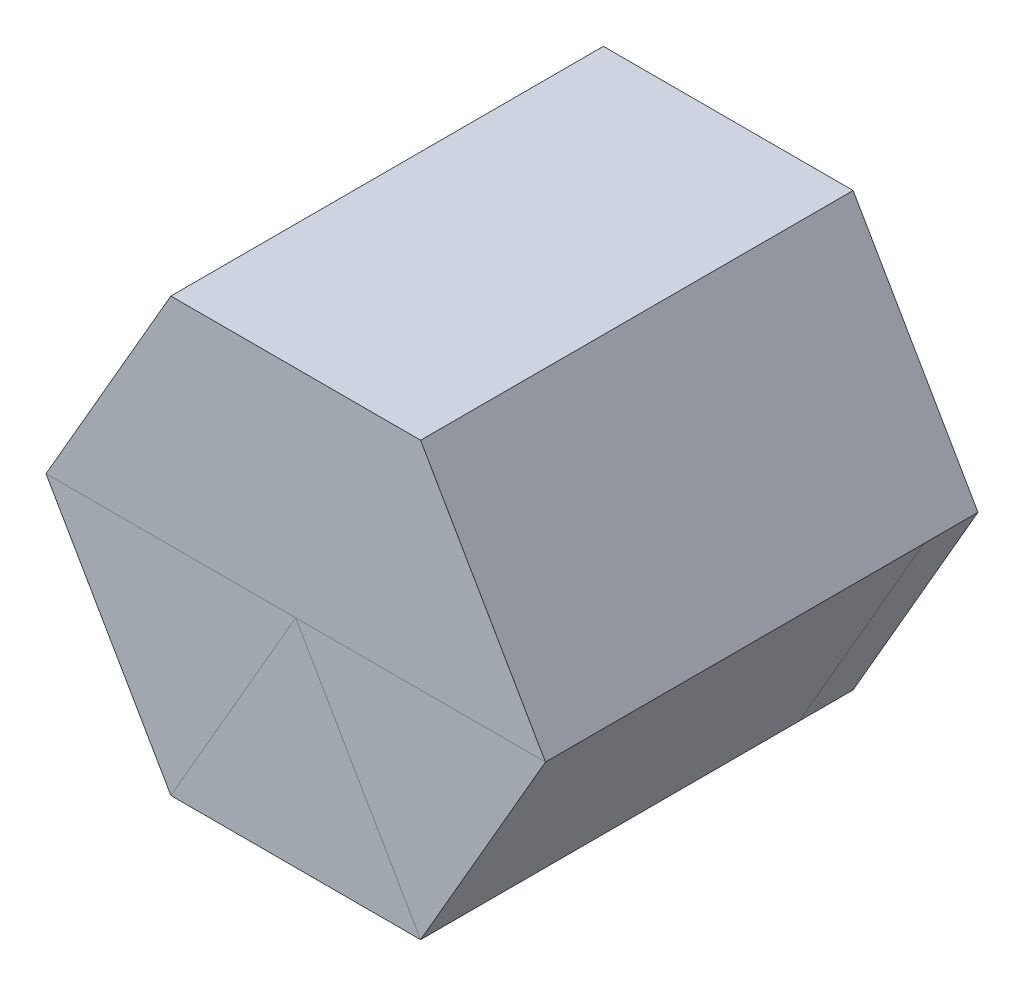
ISO-10303-21;
HEADER;
FILE_DESCRIPTION(('STEP AP214'),'2;1');
FILE_NAME('part.step','',(''),(''),'','','');
FILE_SCHEMA(('AUTOMOTIVE_DESIGN { 1 0 10303 214 1 1 1 1 }'));
ENDSEC;
DATA;
#1=APPLICATION_CONTEXT('core data for automotive mechanical design processes');
#2=APPLICATION_PROTOCOL_DEFINITION('international standard','automotive_design',2000,#1);
#3=PRODUCT_CONTEXT('',#1,'mechanical');
#4=PRODUCT('Part','Part','',(#3));
#5=PRODUCT_RELATED_PRODUCT_CATEGORY('part','',(#4));
#6=PRODUCT_DEFINITION_FORMATION('','',#4);
#7=PRODUCT_DEFINITION_CONTEXT('part definition',#1,'design');
#8=PRODUCT_DEFINITION('design','',#6,#7);
#9=PRODUCT_DEFINITION_SHAPE('','',#8);
#10=(LENGTH_UNIT() NAMED_UNIT(*) SI_UNIT(.MILLI.,.METRE.));
#11=(NAMED_UNIT(*) PLANE_ANGLE_UNIT() SI_UNIT($,.RADIAN.));
#12=(NAMED_UNIT(*) SI_UNIT($,.STERADIAN.) SOLID_ANGLE_UNIT());
#13=UNCERTAINTY_MEASURE_WITH_UNIT(LENGTH_MEASURE(1.E-05),#10,'distance_accuracy_value','');
#14=(GEOMETRIC_REPRESENTATION_CONTEXT(3) GLOBAL_UNCERTAINTY_ASSIGNED_CONTEXT((#13)) GLOBAL_UNIT_ASSIGNED_CONTEXT((#10,
#11,#12)) REPRESENTATION_CONTEXT('',''));
#15=CARTESIAN_POINT('',(0.,0.,0.));
#16=DIRECTION('',(0.,0.,1.));
#17=DIRECTION('',(1.,0.,0.));
#18=AXIS2_PLACEMENT_3D('',#15,#16,#17);
#19=CARTESIAN_POINT('',(21.9970452561247,-12.7,89.5991408839594));
#20=DIRECTION('',(0.866025403784438,-0.5,0.));
#21=DIRECTION('',(0.5,0.866025403784439,0.));
#22=AXIS2_PLACEMENT_3D('',#19,#20,#21);
#23=PLANE('',#22);
#24=DIRECTION('',(0.,0.,-1.));
#25=VECTOR('',#24,1.);
#26=CARTESIAN_POINT('',(29.329393674833,0.,89.5991408839594));
#27=LINE('',#26,#25);
#28=CARTESIAN_POINT('',(29.329393674833,0.,50.8));
#29=VERTEX_POINT('',#28);
#30=CARTESIAN_POINT('',(29.329393674833,0.,6.35));
#31=VERTEX_POINT('',#30);
#32=EDGE_CURVE('E85',#29,#31,#27,.T.);
#33=ORIENTED_EDGE('',*,*,#32,.F.);
#34=DIRECTION('',(-0.5,-0.866025403784439,0.));
#35=VECTOR('',#34,1.);
#36=CARTESIAN_POINT('',(21.9970452561247,-12.7,50.8));
#37=LINE('',#36,#35);
#38=CARTESIAN_POINT('',(14.6646968374165,-25.4,50.8));
#39=VERTEX_POINT('',#38);
#40=EDGE_CURVE('E102',#29,#39,#37,.T.);
#41=ORIENTED_EDGE('',*,*,#40,.T.);
#42=DIRECTION('',(0.,0.,-1.));
#43=VECTOR('',#42,1.);
#44=CARTESIAN_POINT('',(14.6646968374165,-25.4,89.5991408839594));
#45=LINE('',#44,#43);
#46=CARTESIAN_POINT('',(14.6646968374165,-25.4,6.35));
#47=VERTEX_POINT('',#46);
#48=EDGE_CURVE('E52',#39,#47,#45,.T.);
#49=ORIENTED_EDGE('',*,*,#48,.T.);
#50=DIRECTION('',(-0.5,-0.866025403784439,0.));
#51=VECTOR('',#50,1.);
#52=CARTESIAN_POINT('',(21.9970452561247,-12.7,6.35));
#53=LINE('',#52,#51);
#54=EDGE_CURVE('E95',#31,#47,#53,.T.);
#55=ORIENTED_EDGE('',*,*,#54,.F.);
#56=EDGE_LOOP('',(#33,#41,#49,#55));
#57=FACE_BOUND('',#56,.T.);
#58=ADVANCED_FACE('F48',(#57),#23,.T.);
#59=CARTESIAN_POINT('',(0.,0.,89.5991408839594));
#60=DIRECTION('',(0.,-1.,0.));
#61=DIRECTION('',(0.,0.,-1.));
#62=AXIS2_PLACEMENT_3D('',#59,#60,#61);
#63=PLANE('',#62);
#64=DIRECTION('',(-1.,0.,0.));
#65=VECTOR('',#64,1.);
#66=CARTESIAN_POINT('',(0.,0.,50.8));
#67=LINE('',#66,#65);
#68=CARTESIAN_POINT('',(0.,0.,50.8));
#69=VERTEX_POINT('',#68);
#70=EDGE_CURVE('E57',#29,#69,#67,.T.);
#71=ORIENTED_EDGE('',*,*,#70,.F.);
#72=ORIENTED_EDGE('',*,*,#32,.T.);
#73=DIRECTION('',(-1.,0.,0.));
#74=VECTOR('',#73,1.);
#75=CARTESIAN_POINT('',(0.,0.,6.35));
#76=LINE('',#75,#74);
#77=CARTESIAN_POINT('',(0.,0.,6.35));
#78=VERTEX_POINT('',#77);
#79=EDGE_CURVE('E88',#31,#78,#76,.T.);
#80=ORIENTED_EDGE('',*,*,#79,.T.);
#81=DIRECTION('',(0.,0.,-1.));
#82=VECTOR('',#81,1.);
#83=CARTESIAN_POINT('',(0.,0.,89.5991408839594));
#84=LINE('',#83,#82);
#85=EDGE_CURVE('E70',#69,#78,#84,.T.);
#86=ORIENTED_EDGE('',*,*,#85,.F.);
#87=EDGE_LOOP('',(#71,#72,#80,#86));
#88=FACE_BOUND('',#87,.T.);
#89=ADVANCED_FACE('F87',(#88),#63,.F.);
#90=CARTESIAN_POINT('',(0.,0.,89.5991408839594));
#91=DIRECTION('',(0.866025403784439,0.5,0.));
#92=DIRECTION('',(-0.5,0.866025403784439,0.));
#93=AXIS2_PLACEMENT_3D('',#90,#91,#92);
#94=PLANE('',#93);
#95=DIRECTION('',(0.5,-0.866025403784439,0.));
#96=VECTOR('',#95,1.);
#97=CARTESIAN_POINT('',(0.,0.,50.8));
#98=LINE('',#97,#96);
#99=EDGE_CURVE('E12',#69,#39,#98,.T.);
#100=ORIENTED_EDGE('',*,*,#99,.F.);
#101=ORIENTED_EDGE('',*,*,#85,.T.);
#102=DIRECTION('',(0.5,-0.866025403784439,0.));
#103=VECTOR('',#102,1.);
#104=CARTESIAN_POINT('',(0.,0.,6.35));
#105=LINE('',#104,#103);
#106=EDGE_CURVE('E96',#78,#47,#105,.T.);
#107=ORIENTED_EDGE('',*,*,#106,.T.);
#108=ORIENTED_EDGE('',*,*,#48,.F.);
#109=EDGE_LOOP('',(#100,#101,#107,#108));
#110=FACE_BOUND('',#109,.T.);
#111=ADVANCED_FACE('F104',(#110),#94,.F.);
#112=CARTESIAN_POINT('',(0.,0.,6.35));
#113=DIRECTION('',(0.,0.,1.));
#114=DIRECTION('',(1.,0.,0.));
#115=AXIS2_PLACEMENT_3D('',#112,#113,#114);
#116=PLANE('',#115);
#117=ORIENTED_EDGE('',*,*,#54,.T.);
#118=ORIENTED_EDGE('',*,*,#106,.F.);
#119=ORIENTED_EDGE('',*,*,#79,.F.);
#120=EDGE_LOOP('',(#117,#118,#119));
#121=FACE_BOUND('',#120,.T.);
#122=ADVANCED_FACE('F94',(#121),#116,.F.);
#123=CARTESIAN_POINT('',(0.,0.,50.8));
#124=DIRECTION('',(0.,0.,1.));
#125=DIRECTION('',(1.,0.,0.));
#126=AXIS2_PLACEMENT_3D('',#123,#124,#125);
#127=PLANE('',#126);
#128=ORIENTED_EDGE('',*,*,#40,.F.);
#129=ORIENTED_EDGE('',*,*,#70,.T.);
#130=ORIENTED_EDGE('',*,*,#99,.T.);
#131=EDGE_LOOP('',(#128,#129,#130));
#132=FACE_BOUND('',#131,.T.);
#133=ADVANCED_FACE('F50',(#132),#127,.T.);
#134=CLOSED_SHELL('',(#58,#89,#111,#122,#133));
#135=MANIFOLD_SOLID_BREP('B2',#134);
#136=CARTESIAN_POINT('',(0.,0.,50.8));
#137=DIRECTION('',(0.,0.,1.));
#138=DIRECTION('',(1.,0.,0.));
#139=AXIS2_PLACEMENT_3D('',#136,#137,#138);
#140=PLANE('',#139);
#141=DIRECTION('',(0.5,-0.866025403784439,0.));
#142=VECTOR('',#141,1.);
#143=CARTESIAN_POINT('',(0.,0.,50.8));
#144=LINE('',#143,#142);
#145=CARTESIAN_POINT('',(0.,0.,50.8));
#146=VERTEX_POINT('',#145);
#147=CARTESIAN_POINT('',(14.6646968374165,-25.4,50.8));
#148=VERTEX_POINT('',#147);
#149=EDGE_CURVE('E188',#146,#148,#144,.T.);
#150=ORIENTED_EDGE('',*,*,#149,.F.);
#151=DIRECTION('',(-0.5,-0.866025403784439,0.));
#152=VECTOR('',#151,1.);
#153=CARTESIAN_POINT('',(0.,0.,50.8));
#154=LINE('',#153,#152);
#155=CARTESIAN_POINT('',(-14.6646968374165,-25.4,50.8));
#156=VERTEX_POINT('',#155);
#157=EDGE_CURVE('E185',#146,#156,#154,.T.);
#158=ORIENTED_EDGE('',*,*,#157,.T.);
#159=DIRECTION('',(-1.,0.,0.));
#160=VECTOR('',#159,1.);
#161=CARTESIAN_POINT('',(0.,-25.4,50.8));
#162=LINE('',#161,#160);
#163=EDGE_CURVE('E190',#148,#156,#162,.T.);
#164=ORIENTED_EDGE('',*,*,#163,.F.);
#165=EDGE_LOOP('',(#150,#158,#164));
#166=FACE_BOUND('',#165,.T.);
#167=ADVANCED_FACE('F156',(#166),#140,.T.);
#168=CARTESIAN_POINT('',(0.,0.,6.35));
#169=DIRECTION('',(0.,0.,-1.));
#170=DIRECTION('',(-1.,0.,0.));
#171=AXIS2_PLACEMENT_3D('',#168,#169,#170);
#172=PLANE('',#171);
#173=DIRECTION('',(-0.5,-0.866025403784439,0.));
#174=VECTOR('',#173,1.);
#175=CARTESIAN_POINT('',(0.,0.,6.35));
#176=LINE('',#175,#174);
#177=CARTESIAN_POINT('',(0.,0.,6.35));
#178=VERTEX_POINT('',#177);
#179=CARTESIAN_POINT('',(-14.6646968374165,-25.4,6.35));
#180=VERTEX_POINT('',#179);
#181=EDGE_CURVE('E46',#178,#180,#176,.T.);
#182=ORIENTED_EDGE('',*,*,#181,.F.);
#183=DIRECTION('',(0.5,-0.866025403784439,0.));
#184=VECTOR('',#183,1.);
#185=CARTESIAN_POINT('',(0.,0.,6.35));
#186=LINE('',#185,#184);
#187=CARTESIAN_POINT('',(14.6646968374165,-25.4,6.35));
#188=VERTEX_POINT('',#187);
#189=EDGE_CURVE('E198',#178,#188,#186,.T.);
#190=ORIENTED_EDGE('',*,*,#189,.T.);
#191=DIRECTION('',(-1.,0.,0.));
#192=VECTOR('',#191,1.);
#193=CARTESIAN_POINT('',(0.,-25.4,6.35));
#194=LINE('',#193,#192);
#195=EDGE_CURVE('E194',#188,#180,#194,.T.);
#196=ORIENTED_EDGE('',*,*,#195,.T.);
#197=EDGE_LOOP('',(#182,#190,#196));
#198=FACE_BOUND('',#197,.T.);
#199=ADVANCED_FACE('F211',(#198),#172,.T.);
#200=CARTESIAN_POINT('',(0.,0.,89.5991408839594));
#201=DIRECTION('',(0.866025403784439,0.5,0.));
#202=DIRECTION('',(-0.5,0.866025403784439,0.));
#203=AXIS2_PLACEMENT_3D('',#200,#201,#202);
#204=PLANE('',#203);
#205=DIRECTION('',(0.,0.,-1.));
#206=VECTOR('',#205,1.);
#207=CARTESIAN_POINT('',(0.,0.,89.5991408839594));
#208=LINE('',#207,#206);
#209=EDGE_CURVE('E159',#146,#178,#208,.T.);
#210=ORIENTED_EDGE('',*,*,#209,.F.);
#211=ORIENTED_EDGE('',*,*,#149,.T.);
#212=DIRECTION('',(0.,0.,-1.));
#213=VECTOR('',#212,1.);
#214=CARTESIAN_POINT('',(14.6646968374165,-25.4,89.5991408839594));
#215=LINE('',#214,#213);
#216=EDGE_CURVE('E193',#148,#188,#215,.T.);
#217=ORIENTED_EDGE('',*,*,#216,.T.);
#218=ORIENTED_EDGE('',*,*,#189,.F.);
#219=EDGE_LOOP('',(#210,#211,#217,#218));
#220=FACE_BOUND('',#219,.T.);
#221=ADVANCED_FACE('F201',(#220),#204,.T.);
#222=CARTESIAN_POINT('',(0.,-25.4,89.5991408839594));
#223=DIRECTION('',(0.,-1.,0.));
#224=DIRECTION('',(0.,0.,-1.));
#225=AXIS2_PLACEMENT_3D('',#222,#223,#224);
#226=PLANE('',#225);
#227=ORIENTED_EDGE('',*,*,#216,.F.);
#228=ORIENTED_EDGE('',*,*,#163,.T.);
#229=DIRECTION('',(0.,0.,-1.));
#230=VECTOR('',#229,1.);
#231=CARTESIAN_POINT('',(-14.6646968374165,-25.4,89.5991408839594));
#232=LINE('',#231,#230);
#233=EDGE_CURVE('E197',#156,#180,#232,.T.);
#234=ORIENTED_EDGE('',*,*,#233,.T.);
#235=ORIENTED_EDGE('',*,*,#195,.F.);
#236=EDGE_LOOP('',(#227,#228,#234,#235));
#237=FACE_BOUND('',#236,.T.);
#238=ADVANCED_FACE('F208',(#237),#226,.T.);
#239=CARTESIAN_POINT('',(0.,0.,89.5991408839594));
#240=DIRECTION('',(0.866025403784439,-0.5,0.));
#241=DIRECTION('',(0.5,0.866025403784439,0.));
#242=AXIS2_PLACEMENT_3D('',#239,#240,#241);
#243=PLANE('',#242);
#244=ORIENTED_EDGE('',*,*,#157,.F.);
#245=ORIENTED_EDGE('',*,*,#209,.T.);
#246=ORIENTED_EDGE('',*,*,#181,.T.);
#247=ORIENTED_EDGE('',*,*,#233,.F.);
#248=EDGE_LOOP('',(#244,#245,#246,#247));
#249=FACE_BOUND('',#248,.T.);
#250=ADVANCED_FACE('F196',(#249),#243,.F.);
#251=CLOSED_SHELL('',(#167,#199,#221,#238,#250));
#252=MANIFOLD_SOLID_BREP('B6',#251);
#253=CARTESIAN_POINT('',(0.,0.,50.8));
#254=DIRECTION('',(0.,0.,1.));
#255=DIRECTION('',(1.,0.,0.));
#256=AXIS2_PLACEMENT_3D('',#253,#254,#255);
#257=PLANE('',#256);
#258=DIRECTION('',(-0.5,-0.866025403784439,0.));
#259=VECTOR('',#258,1.);
#260=CARTESIAN_POINT('',(0.,0.,50.8));
#261=LINE('',#260,#259);
#262=CARTESIAN_POINT('',(0.,0.,50.8));
#263=VERTEX_POINT('',#262);
#264=CARTESIAN_POINT('',(-14.6646968374165,-25.4,50.8));
#265=VERTEX_POINT('',#264);
#266=EDGE_CURVE('E271',#263,#265,#261,.T.);
#267=ORIENTED_EDGE('',*,*,#266,.F.);
#268=DIRECTION('',(1.,0.,0.));
#269=VECTOR('',#268,1.);
#270=CARTESIAN_POINT('',(0.,0.,50.8));
#271=LINE('',#270,#269);
#272=CARTESIAN_POINT('',(-29.329393674833,0.,50.8));
#273=VERTEX_POINT('',#272);
#274=EDGE_CURVE('E292',#273,#263,#271,.T.);
#275=ORIENTED_EDGE('',*,*,#274,.F.);
#276=DIRECTION('',(-0.5,0.866025403784439,0.));
#277=VECTOR('',#276,1.);
#278=CARTESIAN_POINT('',(-21.9970452561247,-12.7,50.8));
#279=LINE('',#278,#277);
#280=EDGE_CURVE('E295',#265,#273,#279,.T.);
#281=ORIENTED_EDGE('',*,*,#280,.F.);
#282=EDGE_LOOP('',(#267,#275,#281));
#283=FACE_BOUND('',#282,.T.);
#284=ADVANCED_FACE('F263',(#283),#257,.T.);
#285=CARTESIAN_POINT('',(0.,0.,6.35));
#286=DIRECTION('',(0.,0.,-1.));
#287=DIRECTION('',(-1.,0.,0.));
#288=AXIS2_PLACEMENT_3D('',#285,#286,#287);
#289=PLANE('',#288);
#290=DIRECTION('',(-0.5,-0.866025403784439,0.));
#291=VECTOR('',#290,1.);
#292=CARTESIAN_POINT('',(0.,0.,6.35));
#293=LINE('',#292,#291);
#294=CARTESIAN_POINT('',(0.,0.,6.35));
#295=VERTEX_POINT('',#294);
#296=CARTESIAN_POINT('',(-14.6646968374165,-25.4,6.35));
#297=VERTEX_POINT('',#296);
#298=EDGE_CURVE('E309',#295,#297,#293,.T.);
#299=ORIENTED_EDGE('',*,*,#298,.T.);
#300=DIRECTION('',(-0.5,0.866025403784439,0.));
#301=VECTOR('',#300,1.);
#302=CARTESIAN_POINT('',(-21.9970452561247,-12.7,6.35));
#303=LINE('',#302,#301);
#304=CARTESIAN_POINT('',(-29.329393674833,0.,6.35));
#305=VERTEX_POINT('',#304);
#306=EDGE_CURVE('E301',#297,#305,#303,.T.);
#307=ORIENTED_EDGE('',*,*,#306,.T.);
#308=DIRECTION('',(1.,0.,0.));
#309=VECTOR('',#308,1.);
#310=CARTESIAN_POINT('',(0.,0.,6.35));
#311=LINE('',#310,#309);
#312=EDGE_CURVE('E308',#305,#295,#311,.T.);
#313=ORIENTED_EDGE('',*,*,#312,.T.);
#314=EDGE_LOOP('',(#299,#307,#313));
#315=FACE_BOUND('',#314,.T.);
#316=ADVANCED_FACE('F307',(#315),#289,.T.);
#317=CARTESIAN_POINT('',(-21.9970452561247,-12.7,89.5991408839594));
#318=DIRECTION('',(-0.866025403784438,-0.5,0.));
#319=DIRECTION('',(0.5,-0.866025403784439,0.));
#320=AXIS2_PLACEMENT_3D('',#317,#318,#319);
#321=PLANE('',#320);
#322=DIRECTION('',(0.,0.,-1.));
#323=VECTOR('',#322,1.);
#324=CARTESIAN_POINT('',(-14.6646968374165,-25.4,89.5991408839594));
#325=LINE('',#324,#323);
#326=EDGE_CURVE('E154',#265,#297,#325,.T.);
#327=ORIENTED_EDGE('',*,*,#326,.F.);
#328=ORIENTED_EDGE('',*,*,#280,.T.);
#329=DIRECTION('',(0.,0.,-1.));
#330=VECTOR('',#329,1.);
#331=CARTESIAN_POINT('',(-29.329393674833,0.,89.5991408839594));
#332=LINE('',#331,#330);
#333=EDGE_CURVE('E298',#273,#305,#332,.T.);
#334=ORIENTED_EDGE('',*,*,#333,.T.);
#335=ORIENTED_EDGE('',*,*,#306,.F.);
#336=EDGE_LOOP('',(#327,#328,#334,#335));
#337=FACE_BOUND('',#336,.T.);
#338=ADVANCED_FACE('F300',(#337),#321,.T.);
#339=CARTESIAN_POINT('',(0.,0.,89.5991408839594));
#340=DIRECTION('',(0.,1.,0.));
#341=DIRECTION('',(0.,0.,1.));
#342=AXIS2_PLACEMENT_3D('',#339,#340,#341);
#343=PLANE('',#342);
#344=ORIENTED_EDGE('',*,*,#333,.F.);
#345=ORIENTED_EDGE('',*,*,#274,.T.);
#346=DIRECTION('',(0.,0.,-1.));
#347=VECTOR('',#346,1.);
#348=CARTESIAN_POINT('',(0.,0.,89.5991408839594));
#349=LINE('',#348,#347);
#350=EDGE_CURVE('E312',#263,#295,#349,.T.);
#351=ORIENTED_EDGE('',*,*,#350,.T.);
#352=ORIENTED_EDGE('',*,*,#312,.F.);
#353=EDGE_LOOP('',(#344,#345,#351,#352));
#354=FACE_BOUND('',#353,.T.);
#355=ADVANCED_FACE('F311',(#354),#343,.T.);
#356=CARTESIAN_POINT('',(0.,0.,89.5991408839594));
#357=DIRECTION('',(0.866025403784439,-0.5,0.));
#358=DIRECTION('',(0.5,0.866025403784439,0.));
#359=AXIS2_PLACEMENT_3D('',#356,#357,#358);
#360=PLANE('',#359);
#361=ORIENTED_EDGE('',*,*,#350,.F.);
#362=ORIENTED_EDGE('',*,*,#266,.T.);
#363=ORIENTED_EDGE('',*,*,#326,.T.);
#364=ORIENTED_EDGE('',*,*,#298,.F.);
#365=EDGE_LOOP('',(#361,#362,#363,#364));
#366=FACE_BOUND('',#365,.T.);
#367=ADVANCED_FACE('F319',(#366),#360,.T.);
#368=CLOSED_SHELL('',(#284,#316,#338,#355,#367));
#369=MANIFOLD_SOLID_BREP('B40',#368);
#370=CARTESIAN_POINT('',(0.,0.,50.8));
#371=DIRECTION('',(0.,-1.,0.));
#372=DIRECTION('',(0.,0.,-1.));
#373=AXIS2_PLACEMENT_3D('',#370,#371,#372);
#374=PLANE('',#373);
#375=DIRECTION('',(-1.,0.,0.));
#376=VECTOR('',#375,1.);
#377=CARTESIAN_POINT('',(0.,0.,6.35));
#378=LINE('',#377,#376);
#379=CARTESIAN_POINT('',(29.329393674833,0.,6.35));
#380=VERTEX_POINT('',#379);
#381=CARTESIAN_POINT('',(-29.329393674833,0.,6.35));
#382=VERTEX_POINT('',#381);
#383=EDGE_CURVE('E377',#380,#382,#378,.T.);
#384=ORIENTED_EDGE('',*,*,#383,.F.);
#385=DIRECTION('',(0.,0.,-1.));
#386=VECTOR('',#385,1.);
#387=CARTESIAN_POINT('',(29.329393674833,0.,50.8));
#388=LINE('',#387,#386);
#389=CARTESIAN_POINT('',(29.329393674833,0.,50.8));
#390=VERTEX_POINT('',#389);
#391=EDGE_CURVE('E261',#390,#380,#388,.T.);
#392=ORIENTED_EDGE('',*,*,#391,.F.);
#393=DIRECTION('',(-1.,0.,0.));
#394=VECTOR('',#393,1.);
#395=CARTESIAN_POINT('',(0.,0.,50.8));
#396=LINE('',#395,#394);
#397=CARTESIAN_POINT('',(-29.329393674833,0.,50.8));
#398=VERTEX_POINT('',#397);
#399=EDGE_CURVE('E459',#390,#398,#396,.T.);
#400=ORIENTED_EDGE('',*,*,#399,.T.);
#401=DIRECTION('',(0.,0.,-1.));
#402=VECTOR('',#401,1.);
#403=CARTESIAN_POINT('',(-29.329393674833,0.,50.8));
#404=LINE('',#403,#402);
#405=EDGE_CURVE('E465',#398,#382,#404,.T.);
#406=ORIENTED_EDGE('',*,*,#405,.T.);
#407=EDGE_LOOP('',(#384,#392,#400,#406));
#408=FACE_BOUND('',#407,.T.);
#409=ADVANCED_FACE('F361',(#408),#374,.T.);
#410=CARTESIAN_POINT('',(21.9970452561247,12.7,50.8));
#411=DIRECTION('',(-0.866025403784439,-0.5,0.));
#412=DIRECTION('',(0.5,-0.866025403784439,0.));
#413=AXIS2_PLACEMENT_3D('',#410,#411,#412);
#414=PLANE('',#413);
#415=DIRECTION('',(-0.5,0.866025403784439,0.));
#416=VECTOR('',#415,1.);
#417=CARTESIAN_POINT('',(21.9970452561247,12.7,0.));
#418=LINE('',#417,#416);
#419=CARTESIAN_POINT('',(29.329393674833,0.,0.));
#420=VERTEX_POINT('',#419);
#421=CARTESIAN_POINT('',(14.6646968374165,25.4,0.));
#422=VERTEX_POINT('',#421);
#423=EDGE_CURVE('E451',#420,#422,#418,.T.);
#424=ORIENTED_EDGE('',*,*,#423,.T.);
#425=DIRECTION('',(0.,0.,-1.));
#426=VECTOR('',#425,1.);
#427=CARTESIAN_POINT('',(14.6646968374165,25.4,50.8));
#428=LINE('',#427,#426);
#429=CARTESIAN_POINT('',(14.6646968374165,25.4,50.8));
#430=VERTEX_POINT('',#429);
#431=EDGE_CURVE('E369',#430,#422,#428,.T.);
#432=ORIENTED_EDGE('',*,*,#431,.F.);
#433=DIRECTION('',(-0.5,0.866025403784439,0.));
#434=VECTOR('',#433,1.);
#435=CARTESIAN_POINT('',(21.9970452561247,12.7,50.8));
#436=LINE('',#435,#434);
#437=EDGE_CURVE('E461',#390,#430,#436,.T.);
#438=ORIENTED_EDGE('',*,*,#437,.F.);
#439=ORIENTED_EDGE('',*,*,#391,.T.);
#440=DIRECTION('',(0.,0.,-1.));
#441=VECTOR('',#440,1.);
#442=CARTESIAN_POINT('',(29.329393674833,0.,6.35));
#443=LINE('',#442,#441);
#444=EDGE_CURVE('E455',#380,#420,#443,.T.);
#445=ORIENTED_EDGE('',*,*,#444,.T.);
#446=EDGE_LOOP('',(#424,#432,#438,#439,#445));
#447=FACE_BOUND('',#446,.T.);
#448=ADVANCED_FACE('F496',(#447),#414,.F.);
#449=CARTESIAN_POINT('',(0.,25.4,50.8));
#450=DIRECTION('',(0.,-1.,0.));
#451=DIRECTION('',(0.,0.,-1.));
#452=AXIS2_PLACEMENT_3D('',#449,#450,#451);
#453=PLANE('',#452);
#454=DIRECTION('',(-1.,0.,0.));
#455=VECTOR('',#454,1.);
#456=CARTESIAN_POINT('',(0.,25.4,0.));
#457=LINE('',#456,#455);
#458=CARTESIAN_POINT('',(-14.6646968374165,25.4,0.));
#459=VERTEX_POINT('',#458);
#460=EDGE_CURVE('E453',#422,#459,#457,.T.);
#461=ORIENTED_EDGE('',*,*,#460,.T.);
#462=DIRECTION('',(0.,0.,-1.));
#463=VECTOR('',#462,1.);
#464=CARTESIAN_POINT('',(-14.6646968374165,25.4,50.8));
#465=LINE('',#464,#463);
#466=CARTESIAN_POINT('',(-14.6646968374165,25.4,50.8));
#467=VERTEX_POINT('',#466);
#468=EDGE_CURVE('E471',#467,#459,#465,.T.);
#469=ORIENTED_EDGE('',*,*,#468,.F.);
#470=DIRECTION('',(-1.,0.,0.));
#471=VECTOR('',#470,1.);
#472=CARTESIAN_POINT('',(0.,25.4,50.8));
#473=LINE('',#472,#471);
#474=EDGE_CURVE('E463',#430,#467,#473,.T.);
#475=ORIENTED_EDGE('',*,*,#474,.F.);
#476=ORIENTED_EDGE('',*,*,#431,.T.);
#477=EDGE_LOOP('',(#461,#469,#475,#476));
#478=FACE_BOUND('',#477,.T.);
#479=ADVANCED_FACE('F499',(#478),#453,.F.);
#480=CARTESIAN_POINT('',(-21.9970452561247,12.7,50.8));
#481=DIRECTION('',(0.866025403784439,-0.5,0.));
#482=DIRECTION('',(0.5,0.866025403784439,0.));
#483=AXIS2_PLACEMENT_3D('',#480,#481,#482);
#484=PLANE('',#483);
#485=DIRECTION('',(-0.5,-0.866025403784439,0.));
#486=VECTOR('',#485,1.);
#487=CARTESIAN_POINT('',(-21.9970452561247,12.7,0.));
#488=LINE('',#487,#486);
#489=CARTESIAN_POINT('',(-29.329393674833,0.,0.));
#490=VERTEX_POINT('',#489);
#491=EDGE_CURVE('E407',#459,#490,#488,.T.);
#492=ORIENTED_EDGE('',*,*,#491,.T.);
#493=DIRECTION('',(0.,0.,-1.));
#494=VECTOR('',#493,1.);
#495=CARTESIAN_POINT('',(-29.329393674833,0.,6.35));
#496=LINE('',#495,#494);
#497=EDGE_CURVE('E478',#382,#490,#496,.T.);
#498=ORIENTED_EDGE('',*,*,#497,.F.);
#499=ORIENTED_EDGE('',*,*,#405,.F.);
#500=DIRECTION('',(-0.5,-0.866025403784439,0.));
#501=VECTOR('',#500,1.);
#502=CARTESIAN_POINT('',(-21.9970452561247,12.7,50.8));
#503=LINE('',#502,#501);
#504=EDGE_CURVE('E385',#467,#398,#503,.T.);
#505=ORIENTED_EDGE('',*,*,#504,.F.);
#506=ORIENTED_EDGE('',*,*,#468,.T.);
#507=EDGE_LOOP('',(#492,#498,#499,#505,#506));
#508=FACE_BOUND('',#507,.T.);
#509=ADVANCED_FACE('F502',(#508),#484,.F.);
#510=CARTESIAN_POINT('',(0.,0.,50.8));
#511=DIRECTION('',(0.,0.,1.));
#512=DIRECTION('',(1.,0.,0.));
#513=AXIS2_PLACEMENT_3D('',#510,#511,#512);
#514=PLANE('',#513);
#515=ORIENTED_EDGE('',*,*,#399,.F.);
#516=ORIENTED_EDGE('',*,*,#437,.T.);
#517=ORIENTED_EDGE('',*,*,#474,.T.);
#518=ORIENTED_EDGE('',*,*,#504,.T.);
#519=EDGE_LOOP('',(#515,#516,#517,#518));
#520=FACE_BOUND('',#519,.T.);
#521=ADVANCED_FACE('F503',(#520),#514,.T.);
#522=CARTESIAN_POINT('',(0.,0.,0.));
#523=DIRECTION('',(0.,0.,1.));
#524=DIRECTION('',(1.,0.,0.));
#525=AXIS2_PLACEMENT_3D('',#522,#523,#524);
#526=PLANE('',#525);
#527=ORIENTED_EDGE('',*,*,#423,.F.);
#528=DIRECTION('',(0.5,0.866025403784439,0.));
#529=VECTOR('',#528,1.);
#530=CARTESIAN_POINT('',(21.9970452561247,-12.7,0.));
#531=LINE('',#530,#529);
#532=CARTESIAN_POINT('',(14.6646968374165,-25.4,0.));
#533=VERTEX_POINT('',#532);
#534=EDGE_CURVE('E446',#533,#420,#531,.T.);
#535=ORIENTED_EDGE('',*,*,#534,.F.);
#536=DIRECTION('',(1.,0.,0.));
#537=VECTOR('',#536,1.);
#538=CARTESIAN_POINT('',(0.,-25.4,0.));
#539=LINE('',#538,#537);
#540=CARTESIAN_POINT('',(-14.6646968374165,-25.4,0.));
#541=VERTEX_POINT('',#540);
#542=EDGE_CURVE('E483',#541,#533,#539,.T.);
#543=ORIENTED_EDGE('',*,*,#542,.F.);
#544=DIRECTION('',(0.5,-0.866025403784439,0.));
#545=VECTOR('',#544,1.);
#546=CARTESIAN_POINT('',(-21.9970452561247,-12.7,0.));
#547=LINE('',#546,#545);
#548=EDGE_CURVE('E450',#490,#541,#547,.T.);
#549=ORIENTED_EDGE('',*,*,#548,.F.);
#550=ORIENTED_EDGE('',*,*,#491,.F.);
#551=ORIENTED_EDGE('',*,*,#460,.F.);
#552=EDGE_LOOP('',(#527,#535,#543,#549,#550,#551));
#553=FACE_BOUND('',#552,.T.);
#554=ADVANCED_FACE('F491',(#553),#526,.F.);
#555=CARTESIAN_POINT('',(-21.9970452561247,-12.7,6.35));
#556=DIRECTION('',(0.866025403784439,0.5,0.));
#557=DIRECTION('',(-0.5,0.866025403784439,0.));
#558=AXIS2_PLACEMENT_3D('',#555,#556,#557);
#559=PLANE('',#558);
#560=ORIENTED_EDGE('',*,*,#548,.T.);
#561=DIRECTION('',(0.,0.,-1.));
#562=VECTOR('',#561,1.);
#563=CARTESIAN_POINT('',(-14.6646968374165,-25.4,6.35));
#564=LINE('',#563,#562);
#565=CARTESIAN_POINT('',(-14.6646968374165,-25.4,6.35));
#566=VERTEX_POINT('',#565);
#567=EDGE_CURVE('E433',#566,#541,#564,.T.);
#568=ORIENTED_EDGE('',*,*,#567,.F.);
#569=DIRECTION('',(0.5,-0.866025403784439,0.));
#570=VECTOR('',#569,1.);
#571=CARTESIAN_POINT('',(-21.9970452561247,-12.7,6.35));
#572=LINE('',#571,#570);
#573=EDGE_CURVE('E441',#382,#566,#572,.T.);
#574=ORIENTED_EDGE('',*,*,#573,.F.);
#575=ORIENTED_EDGE('',*,*,#497,.T.);
#576=EDGE_LOOP('',(#560,#568,#574,#575));
#577=FACE_BOUND('',#576,.T.);
#578=ADVANCED_FACE('F448',(#577),#559,.F.);
#579=CARTESIAN_POINT('',(0.,-25.4,6.35));
#580=DIRECTION('',(0.,1.,0.));
#581=DIRECTION('',(0.,0.,1.));
#582=AXIS2_PLACEMENT_3D('',#579,#580,#581);
#583=PLANE('',#582);
#584=ORIENTED_EDGE('',*,*,#542,.T.);
#585=DIRECTION('',(0.,0.,-1.));
#586=VECTOR('',#585,1.);
#587=CARTESIAN_POINT('',(14.6646968374165,-25.4,6.35));
#588=LINE('',#587,#586);
#589=CARTESIAN_POINT('',(14.6646968374165,-25.4,6.35));
#590=VERTEX_POINT('',#589);
#591=EDGE_CURVE('E436',#590,#533,#588,.T.);
#592=ORIENTED_EDGE('',*,*,#591,.F.);
#593=DIRECTION('',(1.,0.,0.));
#594=VECTOR('',#593,1.);
#595=CARTESIAN_POINT('',(0.,-25.4,6.35));
#596=LINE('',#595,#594);
#597=EDGE_CURVE('E429',#566,#590,#596,.T.);
#598=ORIENTED_EDGE('',*,*,#597,.F.);
#599=ORIENTED_EDGE('',*,*,#567,.T.);
#600=EDGE_LOOP('',(#584,#592,#598,#599));
#601=FACE_BOUND('',#600,.T.);
#602=ADVANCED_FACE('F431',(#601),#583,.F.);
#603=CARTESIAN_POINT('',(21.9970452561247,-12.7,6.35));
#604=DIRECTION('',(-0.866025403784439,0.5,0.));
#605=DIRECTION('',(-0.5,-0.866025403784439,0.));
#606=AXIS2_PLACEMENT_3D('',#603,#604,#605);
#607=PLANE('',#606);
#608=ORIENTED_EDGE('',*,*,#534,.T.);
#609=ORIENTED_EDGE('',*,*,#444,.F.);
#610=DIRECTION('',(0.5,0.866025403784439,0.));
#611=VECTOR('',#610,1.);
#612=CARTESIAN_POINT('',(21.9970452561247,-12.7,6.35));
#613=LINE('',#612,#611);
#614=EDGE_CURVE('E440',#590,#380,#613,.T.);
#615=ORIENTED_EDGE('',*,*,#614,.F.);
#616=ORIENTED_EDGE('',*,*,#591,.T.);
#617=EDGE_LOOP('',(#608,#609,#615,#616));
#618=FACE_BOUND('',#617,.T.);
#619=ADVANCED_FACE('F488',(#618),#607,.F.);
#620=CARTESIAN_POINT('',(0.,0.,6.35));
#621=DIRECTION('',(0.,0.,1.));
#622=DIRECTION('',(1.,0.,0.));
#623=AXIS2_PLACEMENT_3D('',#620,#621,#622);
#624=PLANE('',#623);
#625=ORIENTED_EDGE('',*,*,#573,.T.);
#626=ORIENTED_EDGE('',*,*,#597,.T.);
#627=ORIENTED_EDGE('',*,*,#614,.T.);
#628=ORIENTED_EDGE('',*,*,#383,.T.);
#629=EDGE_LOOP('',(#625,#626,#627,#628));
#630=FACE_BOUND('',#629,.T.);
#631=ADVANCED_FACE('F444',(#630),#624,.T.);
#632=CLOSED_SHELL('',(#409,#448,#479,#509,#521,#554,#578,#602,#619,#631));
#633=MANIFOLD_SOLID_BREP('B148',#632);
#634=ADVANCED_BREP_SHAPE_REPRESENTATION('',(#18,#135,#252,#369,#633),#14);
#635=SHAPE_DEFINITION_REPRESENTATION(#9,#634);
ENDSEC;
END-ISO-10303-21;
